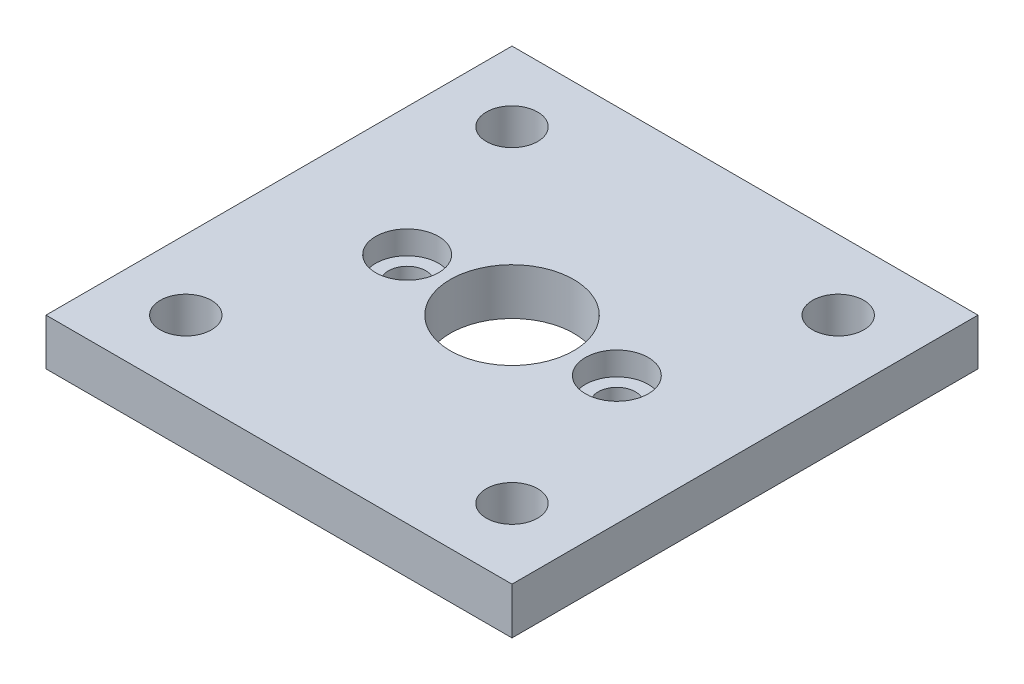
ISO-10303-21;
HEADER;
FILE_DESCRIPTION(('STEP AP214'),'2;1');
FILE_NAME('part.step','',(''),(''),'','','');
FILE_SCHEMA(('AUTOMOTIVE_DESIGN { 1 0 10303 214 1 1 1 1 }'));
ENDSEC;
DATA;
#1=APPLICATION_CONTEXT('core data for automotive mechanical design processes');
#2=APPLICATION_PROTOCOL_DEFINITION('international standard','automotive_design',2000,#1);
#3=PRODUCT_CONTEXT('',#1,'mechanical');
#4=PRODUCT('Part','Part','',(#3));
#5=PRODUCT_RELATED_PRODUCT_CATEGORY('part','',(#4));
#6=PRODUCT_DEFINITION_FORMATION('','',#4);
#7=PRODUCT_DEFINITION_CONTEXT('part definition',#1,'design');
#8=PRODUCT_DEFINITION('design','',#6,#7);
#9=PRODUCT_DEFINITION_SHAPE('','',#8);
#10=(LENGTH_UNIT() NAMED_UNIT(*) SI_UNIT(.MILLI.,.METRE.));
#11=(NAMED_UNIT(*) PLANE_ANGLE_UNIT() SI_UNIT($,.RADIAN.));
#12=(NAMED_UNIT(*) SI_UNIT($,.STERADIAN.) SOLID_ANGLE_UNIT());
#13=UNCERTAINTY_MEASURE_WITH_UNIT(LENGTH_MEASURE(1.E-05),#10,'distance_accuracy_value','');
#14=(GEOMETRIC_REPRESENTATION_CONTEXT(3) GLOBAL_UNCERTAINTY_ASSIGNED_CONTEXT((#13)) GLOBAL_UNIT_ASSIGNED_CONTEXT((#10,
#11,#12)) REPRESENTATION_CONTEXT('',''));
#15=CARTESIAN_POINT('',(0.,0.,0.));
#16=DIRECTION('',(0.,0.,1.));
#17=DIRECTION('',(1.,0.,0.));
#18=AXIS2_PLACEMENT_3D('',#15,#16,#17);
#19=CARTESIAN_POINT('',(-4.49999999999998,2.,0.));
#20=DIRECTION('',(0.,-1.,0.));
#21=DIRECTION('',(0.,0.,-1.));
#22=AXIS2_PLACEMENT_3D('',#19,#20,#21);
#23=CYLINDRICAL_SURFACE('',#22,0.8);
#24=CARTESIAN_POINT('',(-4.49999999999998,0.,0.));
#25=DIRECTION('',(0.,1.,0.));
#26=DIRECTION('',(0.,0.,1.));
#27=AXIS2_PLACEMENT_3D('',#24,#25,#26);
#28=CIRCLE('',#27,0.8);
#29=CARTESIAN_POINT('',(-4.49999999999998,0.,0.800000000000003));
#30=VERTEX_POINT('',#29);
#31=EDGE_CURVE('E110',#30,#30,#28,.T.);
#32=ORIENTED_EDGE('',*,*,#31,.F.);
#33=EDGE_LOOP('',(#32));
#34=FACE_BOUND('',#33,.T.);
#35=CARTESIAN_POINT('',(-4.49999999999998,1.,0.));
#36=DIRECTION('',(0.,1.,0.));
#37=DIRECTION('',(0.,0.,1.));
#38=AXIS2_PLACEMENT_3D('',#35,#36,#37);
#39=CIRCLE('',#38,0.8);
#40=CARTESIAN_POINT('',(-4.49999999999998,1.,0.800000000000003));
#41=VERTEX_POINT('',#40);
#42=EDGE_CURVE('E43',#41,#41,#39,.T.);
#43=ORIENTED_EDGE('',*,*,#42,.T.);
#44=EDGE_LOOP('',(#43));
#45=FACE_BOUND('',#44,.T.);
#46=ADVANCED_FACE('F39',(#34,#45),#23,.F.);
#47=CARTESIAN_POINT('',(4.49999999999998,2.,0.));
#48=DIRECTION('',(0.,-1.,0.));
#49=DIRECTION('',(0.,0.,-1.));
#50=AXIS2_PLACEMENT_3D('',#47,#48,#49);
#51=CYLINDRICAL_SURFACE('',#50,0.800000000000001);
#52=CARTESIAN_POINT('',(4.49999999999998,0.,0.));
#53=DIRECTION('',(0.,1.,0.));
#54=DIRECTION('',(0.,0.,1.));
#55=AXIS2_PLACEMENT_3D('',#52,#53,#54);
#56=CIRCLE('',#55,0.800000000000001);
#57=CARTESIAN_POINT('',(4.49999999999998,0.,0.800000000000002));
#58=VERTEX_POINT('',#57);
#59=EDGE_CURVE('E143',#58,#58,#56,.T.);
#60=ORIENTED_EDGE('',*,*,#59,.F.);
#61=EDGE_LOOP('',(#60));
#62=FACE_BOUND('',#61,.T.);
#63=CARTESIAN_POINT('',(4.49999999999998,1.,0.));
#64=DIRECTION('',(0.,1.,0.));
#65=DIRECTION('',(0.,0.,1.));
#66=AXIS2_PLACEMENT_3D('',#63,#64,#65);
#67=CIRCLE('',#66,0.800000000000001);
#68=CARTESIAN_POINT('',(4.49999999999998,1.,0.800000000000002));
#69=VERTEX_POINT('',#68);
#70=EDGE_CURVE('E115',#69,#69,#67,.T.);
#71=ORIENTED_EDGE('',*,*,#70,.T.);
#72=EDGE_LOOP('',(#71));
#73=FACE_BOUND('',#72,.T.);
#74=ADVANCED_FACE('F156',(#62,#73),#51,.F.);
#75=CARTESIAN_POINT('',(0.,2.,0.));
#76=DIRECTION('',(0.,-1.,0.));
#77=DIRECTION('',(0.,0.,-1.));
#78=AXIS2_PLACEMENT_3D('',#75,#76,#77);
#79=PLANE('',#78);
#80=CARTESIAN_POINT('',(-7.,2.,7.));
#81=DIRECTION('',(0.,-1.,0.));
#82=DIRECTION('',(0.,0.,-1.));
#83=AXIS2_PLACEMENT_3D('',#80,#81,#82);
#84=CIRCLE('',#83,1.1);
#85=CARTESIAN_POINT('',(-7.,2.,5.9));
#86=VERTEX_POINT('',#85);
#87=EDGE_CURVE('E350',#86,#86,#84,.T.);
#88=ORIENTED_EDGE('',*,*,#87,.T.);
#89=EDGE_LOOP('',(#88));
#90=FACE_BOUND('',#89,.T.);
#91=CARTESIAN_POINT('',(-7.,2.,-7.));
#92=DIRECTION('',(0.,-1.,0.));
#93=DIRECTION('',(0.,0.,-1.));
#94=AXIS2_PLACEMENT_3D('',#91,#92,#93);
#95=CIRCLE('',#94,1.1);
#96=CARTESIAN_POINT('',(-7.,2.,-8.1));
#97=VERTEX_POINT('',#96);
#98=EDGE_CURVE('E354',#97,#97,#95,.T.);
#99=ORIENTED_EDGE('',*,*,#98,.T.);
#100=EDGE_LOOP('',(#99));
#101=FACE_BOUND('',#100,.T.);
#102=CARTESIAN_POINT('',(7.,2.,-7.));
#103=DIRECTION('',(0.,-1.,0.));
#104=DIRECTION('',(0.,0.,-1.));
#105=AXIS2_PLACEMENT_3D('',#102,#103,#104);
#106=CIRCLE('',#105,1.1);
#107=CARTESIAN_POINT('',(7.,2.,-8.1));
#108=VERTEX_POINT('',#107);
#109=EDGE_CURVE('E369',#108,#108,#106,.T.);
#110=ORIENTED_EDGE('',*,*,#109,.T.);
#111=EDGE_LOOP('',(#110));
#112=FACE_BOUND('',#111,.T.);
#113=CARTESIAN_POINT('',(7.,2.,7.));
#114=DIRECTION('',(0.,-1.,0.));
#115=DIRECTION('',(0.,0.,-1.));
#116=AXIS2_PLACEMENT_3D('',#113,#114,#115);
#117=CIRCLE('',#116,1.1);
#118=CARTESIAN_POINT('',(7.,2.,5.9));
#119=VERTEX_POINT('',#118);
#120=EDGE_CURVE('E139',#119,#119,#117,.T.);
#121=ORIENTED_EDGE('',*,*,#120,.T.);
#122=EDGE_LOOP('',(#121));
#123=FACE_BOUND('',#122,.T.);
#124=CARTESIAN_POINT('',(-4.49999999999998,2.,0.));
#125=DIRECTION('',(0.,1.,0.));
#126=DIRECTION('',(0.,0.,1.));
#127=AXIS2_PLACEMENT_3D('',#124,#125,#126);
#128=CIRCLE('',#127,1.35);
#129=CARTESIAN_POINT('',(-4.49999999999998,2.,1.35));
#130=VERTEX_POINT('',#129);
#131=EDGE_CURVE('E123',#130,#130,#128,.T.);
#132=ORIENTED_EDGE('',*,*,#131,.F.);
#133=EDGE_LOOP('',(#132));
#134=FACE_BOUND('',#133,.T.);
#135=CARTESIAN_POINT('',(4.49999999999998,2.,0.));
#136=DIRECTION('',(0.,1.,0.));
#137=DIRECTION('',(0.,0.,1.));
#138=AXIS2_PLACEMENT_3D('',#135,#136,#137);
#139=CIRCLE('',#138,1.35);
#140=CARTESIAN_POINT('',(4.49999999999998,2.,1.35));
#141=VERTEX_POINT('',#140);
#142=EDGE_CURVE('E128',#141,#141,#139,.T.);
#143=ORIENTED_EDGE('',*,*,#142,.F.);
#144=EDGE_LOOP('',(#143));
#145=FACE_BOUND('',#144,.T.);
#146=DIRECTION('',(0.,0.,-1.));
#147=VECTOR('',#146,1.);
#148=CARTESIAN_POINT('',(10.,2.,10.));
#149=LINE('',#148,#147);
#150=CARTESIAN_POINT('',(10.,2.,10.));
#151=VERTEX_POINT('',#150);
#152=CARTESIAN_POINT('',(10.,2.,-10.));
#153=VERTEX_POINT('',#152);
#154=EDGE_CURVE('E94',#151,#153,#149,.T.);
#155=ORIENTED_EDGE('',*,*,#154,.T.);
#156=DIRECTION('',(-1.,0.,0.));
#157=VECTOR('',#156,1.);
#158=CARTESIAN_POINT('',(-10.,2.,-10.));
#159=LINE('',#158,#157);
#160=CARTESIAN_POINT('',(-10.,2.,-10.));
#161=VERTEX_POINT('',#160);
#162=EDGE_CURVE('E88',#153,#161,#159,.T.);
#163=ORIENTED_EDGE('',*,*,#162,.T.);
#164=DIRECTION('',(0.,0.,1.));
#165=VECTOR('',#164,1.);
#166=CARTESIAN_POINT('',(-10.,2.,10.));
#167=LINE('',#166,#165);
#168=CARTESIAN_POINT('',(-10.,2.,10.));
#169=VERTEX_POINT('',#168);
#170=EDGE_CURVE('E92',#161,#169,#167,.T.);
#171=ORIENTED_EDGE('',*,*,#170,.T.);
#172=DIRECTION('',(1.,0.,0.));
#173=VECTOR('',#172,1.);
#174=CARTESIAN_POINT('',(-10.,2.,10.));
#175=LINE('',#174,#173);
#176=EDGE_CURVE('E58',#169,#151,#175,.T.);
#177=ORIENTED_EDGE('',*,*,#176,.T.);
#178=EDGE_LOOP('',(#155,#163,#171,#177));
#179=FACE_BOUND('',#178,.T.);
#180=CARTESIAN_POINT('',(0.,2.,0.));
#181=DIRECTION('',(0.,1.,0.));
#182=DIRECTION('',(0.,0.,1.));
#183=AXIS2_PLACEMENT_3D('',#180,#181,#182);
#184=CIRCLE('',#183,2.65);
#185=CARTESIAN_POINT('',(0.,2.,2.65));
#186=VERTEX_POINT('',#185);
#187=EDGE_CURVE('E140',#186,#186,#184,.T.);
#188=ORIENTED_EDGE('',*,*,#187,.F.);
#189=EDGE_LOOP('',(#188));
#190=FACE_BOUND('',#189,.T.);
#191=ADVANCED_FACE('F89',(#90,#101,#112,#123,#134,#145,#179,#190),#79,.F.);
#192=CARTESIAN_POINT('',(0.,0.,0.));
#193=DIRECTION('',(0.,-1.,0.));
#194=DIRECTION('',(0.,0.,-1.));
#195=AXIS2_PLACEMENT_3D('',#192,#193,#194);
#196=PLANE('',#195);
#197=CARTESIAN_POINT('',(-7.,0.,7.));
#198=DIRECTION('',(0.,-1.,0.));
#199=DIRECTION('',(0.,0.,-1.));
#200=AXIS2_PLACEMENT_3D('',#197,#198,#199);
#201=CIRCLE('',#200,1.1);
#202=CARTESIAN_POINT('',(-7.,0.,5.9));
#203=VERTEX_POINT('',#202);
#204=EDGE_CURVE('E353',#203,#203,#201,.T.);
#205=ORIENTED_EDGE('',*,*,#204,.F.);
#206=EDGE_LOOP('',(#205));
#207=FACE_BOUND('',#206,.T.);
#208=CARTESIAN_POINT('',(-7.,0.,-7.));
#209=DIRECTION('',(0.,-1.,0.));
#210=DIRECTION('',(0.,0.,-1.));
#211=AXIS2_PLACEMENT_3D('',#208,#209,#210);
#212=CIRCLE('',#211,1.1);
#213=CARTESIAN_POINT('',(-7.,0.,-8.1));
#214=VERTEX_POINT('',#213);
#215=EDGE_CURVE('E357',#214,#214,#212,.T.);
#216=ORIENTED_EDGE('',*,*,#215,.F.);
#217=EDGE_LOOP('',(#216));
#218=FACE_BOUND('',#217,.T.);
#219=CARTESIAN_POINT('',(7.,0.,-7.));
#220=DIRECTION('',(0.,-1.,0.));
#221=DIRECTION('',(0.,0.,-1.));
#222=AXIS2_PLACEMENT_3D('',#219,#220,#221);
#223=CIRCLE('',#222,1.1);
#224=CARTESIAN_POINT('',(7.,0.,-8.1));
#225=VERTEX_POINT('',#224);
#226=EDGE_CURVE('E365',#225,#225,#223,.T.);
#227=ORIENTED_EDGE('',*,*,#226,.F.);
#228=EDGE_LOOP('',(#227));
#229=FACE_BOUND('',#228,.T.);
#230=CARTESIAN_POINT('',(7.,0.,7.));
#231=DIRECTION('',(0.,-1.,0.));
#232=DIRECTION('',(0.,0.,-1.));
#233=AXIS2_PLACEMENT_3D('',#230,#231,#232);
#234=CIRCLE('',#233,1.1);
#235=CARTESIAN_POINT('',(7.,0.,5.9));
#236=VERTEX_POINT('',#235);
#237=EDGE_CURVE('E131',#236,#236,#234,.T.);
#238=ORIENTED_EDGE('',*,*,#237,.F.);
#239=EDGE_LOOP('',(#238));
#240=FACE_BOUND('',#239,.T.);
#241=ORIENTED_EDGE('',*,*,#59,.T.);
#242=EDGE_LOOP('',(#241));
#243=FACE_BOUND('',#242,.T.);
#244=DIRECTION('',(0.,0.,-1.));
#245=VECTOR('',#244,1.);
#246=CARTESIAN_POINT('',(10.,0.,10.));
#247=LINE('',#246,#245);
#248=CARTESIAN_POINT('',(10.,0.,10.));
#249=VERTEX_POINT('',#248);
#250=CARTESIAN_POINT('',(10.,0.,-10.));
#251=VERTEX_POINT('',#250);
#252=EDGE_CURVE('E107',#249,#251,#247,.T.);
#253=ORIENTED_EDGE('',*,*,#252,.F.);
#254=DIRECTION('',(1.,0.,0.));
#255=VECTOR('',#254,1.);
#256=CARTESIAN_POINT('',(-10.,0.,10.));
#257=LINE('',#256,#255);
#258=CARTESIAN_POINT('',(-10.,0.,10.));
#259=VERTEX_POINT('',#258);
#260=EDGE_CURVE('E81',#259,#249,#257,.T.);
#261=ORIENTED_EDGE('',*,*,#260,.F.);
#262=DIRECTION('',(0.,0.,1.));
#263=VECTOR('',#262,1.);
#264=CARTESIAN_POINT('',(-10.,0.,10.));
#265=LINE('',#264,#263);
#266=CARTESIAN_POINT('',(-10.,0.,-10.));
#267=VERTEX_POINT('',#266);
#268=EDGE_CURVE('E75',#267,#259,#265,.T.);
#269=ORIENTED_EDGE('',*,*,#268,.F.);
#270=DIRECTION('',(-1.,0.,0.));
#271=VECTOR('',#270,1.);
#272=CARTESIAN_POINT('',(-10.,0.,-10.));
#273=LINE('',#272,#271);
#274=EDGE_CURVE('E98',#251,#267,#273,.T.);
#275=ORIENTED_EDGE('',*,*,#274,.F.);
#276=EDGE_LOOP('',(#253,#261,#269,#275));
#277=FACE_BOUND('',#276,.T.);
#278=ORIENTED_EDGE('',*,*,#31,.T.);
#279=EDGE_LOOP('',(#278));
#280=FACE_BOUND('',#279,.T.);
#281=CARTESIAN_POINT('',(0.,0.,0.));
#282=DIRECTION('',(0.,1.,0.));
#283=DIRECTION('',(0.,0.,1.));
#284=AXIS2_PLACEMENT_3D('',#281,#282,#283);
#285=CIRCLE('',#284,2.65);
#286=CARTESIAN_POINT('',(0.,0.,2.65));
#287=VERTEX_POINT('',#286);
#288=EDGE_CURVE('E121',#287,#287,#285,.T.);
#289=ORIENTED_EDGE('',*,*,#288,.T.);
#290=EDGE_LOOP('',(#289));
#291=FACE_BOUND('',#290,.T.);
#292=ADVANCED_FACE('F151',(#207,#218,#229,#240,#243,#277,#280,#291),#196,.T.);
#293=CARTESIAN_POINT('',(10.,2.,10.));
#294=DIRECTION('',(-1.,0.,0.));
#295=DIRECTION('',(0.,0.,1.));
#296=AXIS2_PLACEMENT_3D('',#293,#294,#295);
#297=PLANE('',#296);
#298=ORIENTED_EDGE('',*,*,#252,.T.);
#299=DIRECTION('',(0.,-1.,0.));
#300=VECTOR('',#299,1.);
#301=CARTESIAN_POINT('',(10.,2.,-10.));
#302=LINE('',#301,#300);
#303=EDGE_CURVE('E11',#153,#251,#302,.T.);
#304=ORIENTED_EDGE('',*,*,#303,.F.);
#305=ORIENTED_EDGE('',*,*,#154,.F.);
#306=DIRECTION('',(0.,-1.,0.));
#307=VECTOR('',#306,1.);
#308=CARTESIAN_POINT('',(10.,2.,10.));
#309=LINE('',#308,#307);
#310=EDGE_CURVE('E103',#151,#249,#309,.T.);
#311=ORIENTED_EDGE('',*,*,#310,.T.);
#312=EDGE_LOOP('',(#298,#304,#305,#311));
#313=FACE_BOUND('',#312,.T.);
#314=ADVANCED_FACE('F41',(#313),#297,.F.);
#315=CARTESIAN_POINT('',(-10.,2.,-10.));
#316=DIRECTION('',(0.,0.,1.));
#317=DIRECTION('',(1.,0.,0.));
#318=AXIS2_PLACEMENT_3D('',#315,#316,#317);
#319=PLANE('',#318);
#320=ORIENTED_EDGE('',*,*,#274,.T.);
#321=DIRECTION('',(0.,-1.,0.));
#322=VECTOR('',#321,1.);
#323=CARTESIAN_POINT('',(-10.,2.,-10.));
#324=LINE('',#323,#322);
#325=EDGE_CURVE('E49',#161,#267,#324,.T.);
#326=ORIENTED_EDGE('',*,*,#325,.F.);
#327=ORIENTED_EDGE('',*,*,#162,.F.);
#328=ORIENTED_EDGE('',*,*,#303,.T.);
#329=EDGE_LOOP('',(#320,#326,#327,#328));
#330=FACE_BOUND('',#329,.T.);
#331=ADVANCED_FACE('F97',(#330),#319,.F.);
#332=CARTESIAN_POINT('',(-10.,2.,10.));
#333=DIRECTION('',(1.,0.,0.));
#334=DIRECTION('',(0.,0.,-1.));
#335=AXIS2_PLACEMENT_3D('',#332,#333,#334);
#336=PLANE('',#335);
#337=ORIENTED_EDGE('',*,*,#268,.T.);
#338=DIRECTION('',(0.,-1.,0.));
#339=VECTOR('',#338,1.);
#340=CARTESIAN_POINT('',(-10.,2.,10.));
#341=LINE('',#340,#339);
#342=EDGE_CURVE('E99',#169,#259,#341,.T.);
#343=ORIENTED_EDGE('',*,*,#342,.F.);
#344=ORIENTED_EDGE('',*,*,#170,.F.);
#345=ORIENTED_EDGE('',*,*,#325,.T.);
#346=EDGE_LOOP('',(#337,#343,#344,#345));
#347=FACE_BOUND('',#346,.T.);
#348=ADVANCED_FACE('F101',(#347),#336,.F.);
#349=CARTESIAN_POINT('',(-10.,2.,10.));
#350=DIRECTION('',(0.,0.,-1.));
#351=DIRECTION('',(-1.,0.,0.));
#352=AXIS2_PLACEMENT_3D('',#349,#350,#351);
#353=PLANE('',#352);
#354=ORIENTED_EDGE('',*,*,#260,.T.);
#355=ORIENTED_EDGE('',*,*,#310,.F.);
#356=ORIENTED_EDGE('',*,*,#176,.F.);
#357=ORIENTED_EDGE('',*,*,#342,.T.);
#358=EDGE_LOOP('',(#354,#355,#356,#357));
#359=FACE_BOUND('',#358,.T.);
#360=ADVANCED_FACE('F187',(#359),#353,.F.);
#361=CARTESIAN_POINT('',(0.,2.,0.));
#362=DIRECTION('',(0.,-1.,0.));
#363=DIRECTION('',(0.,0.,-1.));
#364=AXIS2_PLACEMENT_3D('',#361,#362,#363);
#365=CYLINDRICAL_SURFACE('',#364,2.65);
#366=ORIENTED_EDGE('',*,*,#187,.T.);
#367=EDGE_LOOP('',(#366));
#368=FACE_BOUND('',#367,.T.);
#369=ORIENTED_EDGE('',*,*,#288,.F.);
#370=EDGE_LOOP('',(#369));
#371=FACE_BOUND('',#370,.T.);
#372=ADVANCED_FACE('F180',(#368,#371),#365,.F.);
#373=CARTESIAN_POINT('',(4.49999999999998,1.,0.));
#374=DIRECTION('',(0.,1.,0.));
#375=DIRECTION('',(0.,0.,1.));
#376=AXIS2_PLACEMENT_3D('',#373,#374,#375);
#377=CYLINDRICAL_SURFACE('',#376,1.35);
#378=CARTESIAN_POINT('',(4.49999999999998,1.,0.));
#379=DIRECTION('',(0.,1.,0.));
#380=DIRECTION('',(0.,0.,1.));
#381=AXIS2_PLACEMENT_3D('',#378,#379,#380);
#382=CIRCLE('',#381,1.35);
#383=CARTESIAN_POINT('',(4.49999999999998,1.,1.35));
#384=VERTEX_POINT('',#383);
#385=EDGE_CURVE('E136',#384,#384,#382,.T.);
#386=ORIENTED_EDGE('',*,*,#385,.F.);
#387=EDGE_LOOP('',(#386));
#388=FACE_BOUND('',#387,.T.);
#389=ORIENTED_EDGE('',*,*,#142,.T.);
#390=EDGE_LOOP('',(#389));
#391=FACE_BOUND('',#390,.T.);
#392=ADVANCED_FACE('F177',(#388,#391),#377,.F.);
#393=CARTESIAN_POINT('',(4.49999999999998,1.,0.));
#394=DIRECTION('',(0.,1.,0.));
#395=DIRECTION('',(0.,0.,1.));
#396=AXIS2_PLACEMENT_3D('',#393,#394,#395);
#397=PLANE('',#396);
#398=ORIENTED_EDGE('',*,*,#70,.F.);
#399=EDGE_LOOP('',(#398));
#400=FACE_BOUND('',#399,.T.);
#401=ORIENTED_EDGE('',*,*,#385,.T.);
#402=EDGE_LOOP('',(#401));
#403=FACE_BOUND('',#402,.T.);
#404=ADVANCED_FACE('F172',(#400,#403),#397,.T.);
#405=CARTESIAN_POINT('',(-4.49999999999998,1.,0.));
#406=DIRECTION('',(0.,1.,0.));
#407=DIRECTION('',(0.,0.,1.));
#408=AXIS2_PLACEMENT_3D('',#405,#406,#407);
#409=CYLINDRICAL_SURFACE('',#408,1.35);
#410=CARTESIAN_POINT('',(-4.49999999999998,1.,0.));
#411=DIRECTION('',(0.,1.,0.));
#412=DIRECTION('',(0.,0.,1.));
#413=AXIS2_PLACEMENT_3D('',#410,#411,#412);
#414=CIRCLE('',#413,1.35);
#415=CARTESIAN_POINT('',(-4.49999999999998,1.,1.35));
#416=VERTEX_POINT('',#415);
#417=EDGE_CURVE('E117',#416,#416,#414,.T.);
#418=ORIENTED_EDGE('',*,*,#417,.F.);
#419=EDGE_LOOP('',(#418));
#420=FACE_BOUND('',#419,.T.);
#421=ORIENTED_EDGE('',*,*,#131,.T.);
#422=EDGE_LOOP('',(#421));
#423=FACE_BOUND('',#422,.T.);
#424=ADVANCED_FACE('F163',(#420,#423),#409,.F.);
#425=CARTESIAN_POINT('',(-4.49999999999998,1.,0.));
#426=DIRECTION('',(0.,1.,0.));
#427=DIRECTION('',(0.,0.,1.));
#428=AXIS2_PLACEMENT_3D('',#425,#426,#427);
#429=PLANE('',#428);
#430=ORIENTED_EDGE('',*,*,#42,.F.);
#431=EDGE_LOOP('',(#430));
#432=FACE_BOUND('',#431,.T.);
#433=ORIENTED_EDGE('',*,*,#417,.T.);
#434=EDGE_LOOP('',(#433));
#435=FACE_BOUND('',#434,.T.);
#436=ADVANCED_FACE('F160',(#432,#435),#429,.T.);
#437=CARTESIAN_POINT('',(7.,2.,7.));
#438=DIRECTION('',(0.,-1.,0.));
#439=DIRECTION('',(0.,0.,-1.));
#440=AXIS2_PLACEMENT_3D('',#437,#438,#439);
#441=CYLINDRICAL_SURFACE('',#440,1.1);
#442=ORIENTED_EDGE('',*,*,#120,.F.);
#443=EDGE_LOOP('',(#442));
#444=FACE_BOUND('',#443,.T.);
#445=ORIENTED_EDGE('',*,*,#237,.T.);
#446=EDGE_LOOP('',(#445));
#447=FACE_BOUND('',#446,.T.);
#448=ADVANCED_FACE('F162',(#444,#447),#441,.F.);
#449=CARTESIAN_POINT('',(7.,2.,-7.));
#450=DIRECTION('',(0.,-1.,0.));
#451=DIRECTION('',(0.,0.,-1.));
#452=AXIS2_PLACEMENT_3D('',#449,#450,#451);
#453=CYLINDRICAL_SURFACE('',#452,1.1);
#454=ORIENTED_EDGE('',*,*,#109,.F.);
#455=EDGE_LOOP('',(#454));
#456=FACE_BOUND('',#455,.T.);
#457=ORIENTED_EDGE('',*,*,#226,.T.);
#458=EDGE_LOOP('',(#457));
#459=FACE_BOUND('',#458,.T.);
#460=ADVANCED_FACE('F169',(#456,#459),#453,.F.);
#461=CARTESIAN_POINT('',(-7.,2.,-7.));
#462=DIRECTION('',(0.,-1.,0.));
#463=DIRECTION('',(0.,0.,-1.));
#464=AXIS2_PLACEMENT_3D('',#461,#462,#463);
#465=CYLINDRICAL_SURFACE('',#464,1.1);
#466=ORIENTED_EDGE('',*,*,#98,.F.);
#467=EDGE_LOOP('',(#466));
#468=FACE_BOUND('',#467,.T.);
#469=ORIENTED_EDGE('',*,*,#215,.T.);
#470=EDGE_LOOP('',(#469));
#471=FACE_BOUND('',#470,.T.);
#472=ADVANCED_FACE('F319',(#468,#471),#465,.F.);
#473=CARTESIAN_POINT('',(-7.,2.,7.));
#474=DIRECTION('',(0.,-1.,0.));
#475=DIRECTION('',(0.,0.,-1.));
#476=AXIS2_PLACEMENT_3D('',#473,#474,#475);
#477=CYLINDRICAL_SURFACE('',#476,1.1);
#478=ORIENTED_EDGE('',*,*,#87,.F.);
#479=EDGE_LOOP('',(#478));
#480=FACE_BOUND('',#479,.T.);
#481=ORIENTED_EDGE('',*,*,#204,.T.);
#482=EDGE_LOOP('',(#481));
#483=FACE_BOUND('',#482,.T.);
#484=ADVANCED_FACE('F330',(#480,#483),#477,.F.);
#485=CLOSED_SHELL('',(#46,#74,#191,#292,#314,#331,#348,#360,#372,#392,#404,#424,#436,#448,#460,
#472,#484));
#486=MANIFOLD_SOLID_BREP('B2',#485);
#487=ADVANCED_BREP_SHAPE_REPRESENTATION('',(#18,#486),#14);
#488=SHAPE_DEFINITION_REPRESENTATION(#9,#487);
ENDSEC;
END-ISO-10303-21;
